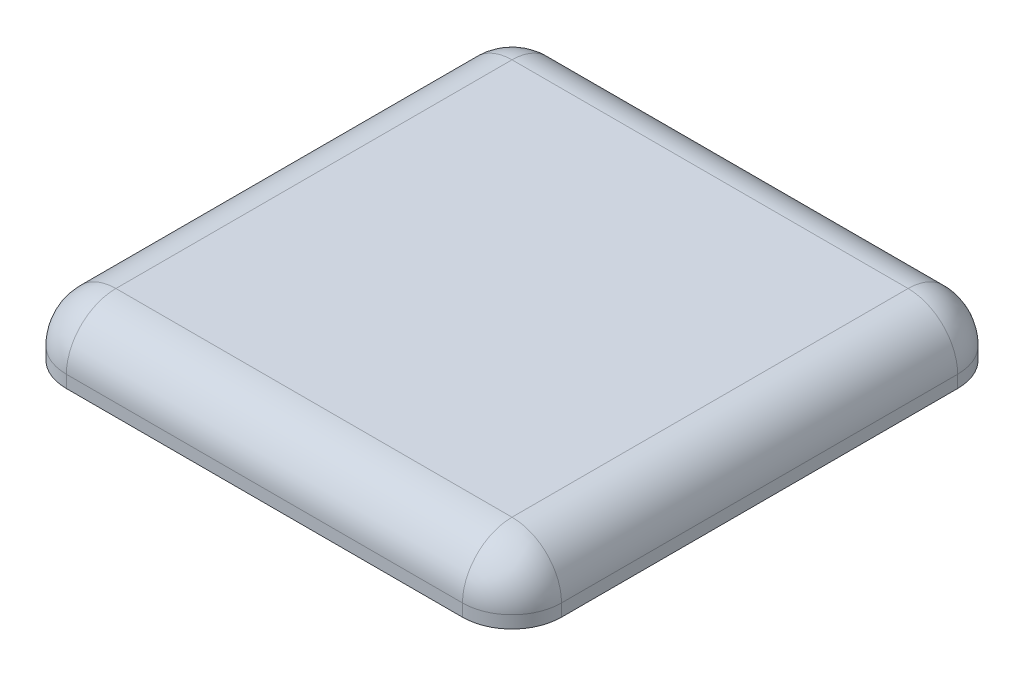
ISO-10303-21;
HEADER;
FILE_DESCRIPTION(('STEP AP214'),'2;1');
FILE_NAME('part.step','',(''),(''),'','','');
FILE_SCHEMA(('AUTOMOTIVE_DESIGN { 1 0 10303 214 1 1 1 1 }'));
ENDSEC;
DATA;
#1=APPLICATION_CONTEXT('core data for automotive mechanical design processes');
#2=APPLICATION_PROTOCOL_DEFINITION('international standard','automotive_design',2000,#1);
#3=PRODUCT_CONTEXT('',#1,'mechanical');
#4=PRODUCT('Part','Part','',(#3));
#5=PRODUCT_RELATED_PRODUCT_CATEGORY('part','',(#4));
#6=PRODUCT_DEFINITION_FORMATION('','',#4);
#7=PRODUCT_DEFINITION_CONTEXT('part definition',#1,'design');
#8=PRODUCT_DEFINITION('design','',#6,#7);
#9=PRODUCT_DEFINITION_SHAPE('','',#8);
#10=(LENGTH_UNIT() NAMED_UNIT(*) SI_UNIT(.MILLI.,.METRE.));
#11=(NAMED_UNIT(*) PLANE_ANGLE_UNIT() SI_UNIT($,.RADIAN.));
#12=(NAMED_UNIT(*) SI_UNIT($,.STERADIAN.) SOLID_ANGLE_UNIT());
#13=UNCERTAINTY_MEASURE_WITH_UNIT(LENGTH_MEASURE(1.E-05),#10,'distance_accuracy_value','');
#14=(GEOMETRIC_REPRESENTATION_CONTEXT(3) GLOBAL_UNCERTAINTY_ASSIGNED_CONTEXT((#13)) GLOBAL_UNIT_ASSIGNED_CONTEXT((#10,
#11,#12)) REPRESENTATION_CONTEXT('',''));
#15=CARTESIAN_POINT('',(0.,0.,0.));
#16=DIRECTION('',(0.,0.,1.));
#17=DIRECTION('',(1.,0.,0.));
#18=AXIS2_PLACEMENT_3D('',#15,#16,#17);
#19=CARTESIAN_POINT('',(0.,0.,0.));
#20=DIRECTION('',(0.,1.,0.));
#21=DIRECTION('',(0.,0.,1.));
#22=AXIS2_PLACEMENT_3D('',#19,#20,#21);
#23=PLANE('',#22);
#24=CARTESIAN_POINT('',(0.,0.,4.5350437814784E-09));
#25=DIRECTION('',(0.,-1.,0.));
#26=DIRECTION('',(0.,0.,1.));
#27=AXIS2_PLACEMENT_3D('',#24,#25,#26);
#28=CIRCLE('',#27,2.25000000000026);
#29=CARTESIAN_POINT('',(-2.01556443482511,0.,1.00000000906969));
#30=VERTEX_POINT('',#29);
#31=CARTESIAN_POINT('',(-2.01556443482491,0.,-1.));
#32=VERTEX_POINT('',#31);
#33=EDGE_CURVE('E231',#30,#32,#28,.T.);
#34=ORIENTED_EDGE('',*,*,#33,.F.);
#35=DIRECTION('',(-1.,0.,0.));
#36=VECTOR('',#35,1.);
#37=CARTESIAN_POINT('',(-2.01556443482511,0.,1.00000000906969));
#38=LINE('',#37,#36);
#39=CARTESIAN_POINT('',(-1.00000000453426,0.,1.00000000906969));
#40=VERTEX_POINT('',#39);
#41=EDGE_CURVE('E244',#40,#30,#38,.T.);
#42=ORIENTED_EDGE('',*,*,#41,.F.);
#43=DIRECTION('',(0.,0.,-1.));
#44=VECTOR('',#43,1.);
#45=CARTESIAN_POINT('',(-1.00000000453426,0.,1.00000000906969));
#46=LINE('',#45,#44);
#47=CARTESIAN_POINT('',(-1.00000000453426,0.,2.01556443936034));
#48=VERTEX_POINT('',#47);
#49=EDGE_CURVE('E293',#48,#40,#46,.T.);
#50=ORIENTED_EDGE('',*,*,#49,.F.);
#51=CARTESIAN_POINT('',(0.,0.,4.5350437814784E-09));
#52=DIRECTION('',(0.,-1.,0.));
#53=DIRECTION('',(0.,0.,1.));
#54=AXIS2_PLACEMENT_3D('',#51,#52,#53);
#55=CIRCLE('',#54,2.25000000000026);
#56=CARTESIAN_POINT('',(1.00000000453478,0.,2.01556443936009));
#57=VERTEX_POINT('',#56);
#58=EDGE_CURVE('E290',#57,#48,#55,.T.);
#59=ORIENTED_EDGE('',*,*,#58,.F.);
#60=DIRECTION('',(0.,0.,1.));
#61=VECTOR('',#60,1.);
#62=CARTESIAN_POINT('',(1.00000000453478,0.,2.01556443936009));
#63=LINE('',#62,#61);
#64=CARTESIAN_POINT('',(1.00000000453478,0.,1.00000000906969));
#65=VERTEX_POINT('',#64);
#66=EDGE_CURVE('E287',#65,#57,#63,.T.);
#67=ORIENTED_EDGE('',*,*,#66,.F.);
#68=DIRECTION('',(-1.,0.,0.));
#69=VECTOR('',#68,1.);
#70=CARTESIAN_POINT('',(1.00000000453478,0.,1.00000000906969));
#71=LINE('',#70,#69);
#72=CARTESIAN_POINT('',(2.01556443482511,0.,1.00000000906969));
#73=VERTEX_POINT('',#72);
#74=EDGE_CURVE('E284',#73,#65,#71,.T.);
#75=ORIENTED_EDGE('',*,*,#74,.F.);
#76=CARTESIAN_POINT('',(0.,0.,4.5350437814784E-09));
#77=DIRECTION('',(0.,-1.,0.));
#78=DIRECTION('',(0.,0.,1.));
#79=AXIS2_PLACEMENT_3D('',#76,#77,#78);
#80=CIRCLE('',#79,2.25000000000026);
#81=CARTESIAN_POINT('',(2.01556443482491,0.,-1.));
#82=VERTEX_POINT('',#81);
#83=EDGE_CURVE('E281',#82,#73,#80,.T.);
#84=ORIENTED_EDGE('',*,*,#83,.F.);
#85=DIRECTION('',(1.,0.,0.));
#86=VECTOR('',#85,1.);
#87=CARTESIAN_POINT('',(2.01556443482491,0.,-1.));
#88=LINE('',#87,#86);
#89=CARTESIAN_POINT('',(1.00000000453478,0.,-1.));
#90=VERTEX_POINT('',#89);
#91=EDGE_CURVE('E278',#90,#82,#88,.T.);
#92=ORIENTED_EDGE('',*,*,#91,.F.);
#93=DIRECTION('',(0.,0.,1.));
#94=VECTOR('',#93,1.);
#95=CARTESIAN_POINT('',(1.00000000453478,0.,-1.));
#96=LINE('',#95,#94);
#97=CARTESIAN_POINT('',(1.00000000453478,0.,-2.01556443029));
#98=VERTEX_POINT('',#97);
#99=EDGE_CURVE('E275',#98,#90,#96,.T.);
#100=ORIENTED_EDGE('',*,*,#99,.F.);
#101=CARTESIAN_POINT('',(0.,0.,4.5350437814784E-09));
#102=DIRECTION('',(0.,-1.,0.));
#103=DIRECTION('',(0.,0.,1.));
#104=AXIS2_PLACEMENT_3D('',#101,#102,#103);
#105=CIRCLE('',#104,2.25000000000026);
#106=CARTESIAN_POINT('',(-1.00000000453426,0.,-2.01556443029026));
#107=VERTEX_POINT('',#106);
#108=EDGE_CURVE('E272',#107,#98,#105,.T.);
#109=ORIENTED_EDGE('',*,*,#108,.F.);
#110=DIRECTION('',(0.,0.,-1.));
#111=VECTOR('',#110,1.);
#112=CARTESIAN_POINT('',(-1.00000000453426,0.,-2.01556443029026));
#113=LINE('',#112,#111);
#114=CARTESIAN_POINT('',(-1.00000000453426,0.,-1.));
#115=VERTEX_POINT('',#114);
#116=EDGE_CURVE('E269',#115,#107,#113,.T.);
#117=ORIENTED_EDGE('',*,*,#116,.F.);
#118=DIRECTION('',(1.,0.,0.));
#119=VECTOR('',#118,1.);
#120=CARTESIAN_POINT('',(-1.00000000453426,0.,-1.));
#121=LINE('',#120,#119);
#122=EDGE_CURVE('E234',#32,#115,#121,.T.);
#123=ORIENTED_EDGE('',*,*,#122,.F.);
#124=EDGE_LOOP('',(#34,#42,#50,#59,#67,#75,#84,#92,#100,#109,#117,#123));
#125=FACE_BOUND('',#124,.T.);
#126=DIRECTION('',(0.,0.,1.));
#127=VECTOR('',#126,1.);
#128=CARTESIAN_POINT('',(-10.,0.,-10.));
#129=LINE('',#128,#127);
#130=CARTESIAN_POINT('',(-10.,0.,-8.));
#131=VERTEX_POINT('',#130);
#132=CARTESIAN_POINT('',(-10.,0.,8.));
#133=VERTEX_POINT('',#132);
#134=EDGE_CURVE('E339',#131,#133,#129,.T.);
#135=ORIENTED_EDGE('',*,*,#134,.F.);
#136=CARTESIAN_POINT('',(-8.,0.,-8.));
#137=DIRECTION('',(0.,1.,0.));
#138=DIRECTION('',(0.,0.,1.));
#139=AXIS2_PLACEMENT_3D('',#136,#137,#138);
#140=CIRCLE('',#139,2.);
#141=CARTESIAN_POINT('',(-8.,0.,-10.));
#142=VERTEX_POINT('',#141);
#143=EDGE_CURVE('E363',#131,#142,#140,.F.);
#144=ORIENTED_EDGE('',*,*,#143,.T.);
#145=DIRECTION('',(-1.,0.,0.));
#146=VECTOR('',#145,1.);
#147=CARTESIAN_POINT('',(10.,0.,-10.));
#148=LINE('',#147,#146);
#149=CARTESIAN_POINT('',(8.,0.,-10.));
#150=VERTEX_POINT('',#149);
#151=EDGE_CURVE('E336',#150,#142,#148,.T.);
#152=ORIENTED_EDGE('',*,*,#151,.F.);
#153=CARTESIAN_POINT('',(8.,0.,-8.));
#154=DIRECTION('',(0.,1.,0.));
#155=DIRECTION('',(0.,0.,1.));
#156=AXIS2_PLACEMENT_3D('',#153,#154,#155);
#157=CIRCLE('',#156,2.);
#158=CARTESIAN_POINT('',(10.,0.,-8.));
#159=VERTEX_POINT('',#158);
#160=EDGE_CURVE('E361',#150,#159,#157,.F.);
#161=ORIENTED_EDGE('',*,*,#160,.T.);
#162=DIRECTION('',(0.,0.,-1.));
#163=VECTOR('',#162,1.);
#164=CARTESIAN_POINT('',(10.,0.,10.));
#165=LINE('',#164,#163);
#166=CARTESIAN_POINT('',(10.,0.,8.));
#167=VERTEX_POINT('',#166);
#168=EDGE_CURVE('E333',#167,#159,#165,.T.);
#169=ORIENTED_EDGE('',*,*,#168,.F.);
#170=CARTESIAN_POINT('',(8.,0.,8.));
#171=DIRECTION('',(0.,1.,0.));
#172=DIRECTION('',(0.,0.,1.));
#173=AXIS2_PLACEMENT_3D('',#170,#171,#172);
#174=CIRCLE('',#173,2.);
#175=CARTESIAN_POINT('',(8.,0.,10.));
#176=VERTEX_POINT('',#175);
#177=EDGE_CURVE('E357',#167,#176,#174,.F.);
#178=ORIENTED_EDGE('',*,*,#177,.T.);
#179=DIRECTION('',(1.,0.,0.));
#180=VECTOR('',#179,1.);
#181=CARTESIAN_POINT('',(-10.,0.,10.));
#182=LINE('',#181,#180);
#183=CARTESIAN_POINT('',(-8.,0.,10.));
#184=VERTEX_POINT('',#183);
#185=EDGE_CURVE('E342',#184,#176,#182,.T.);
#186=ORIENTED_EDGE('',*,*,#185,.F.);
#187=CARTESIAN_POINT('',(-8.,0.,8.));
#188=DIRECTION('',(0.,1.,0.));
#189=DIRECTION('',(0.,0.,1.));
#190=AXIS2_PLACEMENT_3D('',#187,#188,#189);
#191=CIRCLE('',#190,2.);
#192=EDGE_CURVE('E359',#184,#133,#191,.F.);
#193=ORIENTED_EDGE('',*,*,#192,.T.);
#194=EDGE_LOOP('',(#135,#144,#152,#161,#169,#178,#186,#193));
#195=FACE_BOUND('',#194,.T.);
#196=DIRECTION('',(1.,0.,0.));
#197=VECTOR('',#196,1.);
#198=CARTESIAN_POINT('',(-7.5,0.,-2.5));
#199=LINE('',#198,#197);
#200=CARTESIAN_POINT('',(-9.5,0.,-2.5));
#201=VERTEX_POINT('',#200);
#202=CARTESIAN_POINT('',(-7.5,0.,-2.5));
#203=VERTEX_POINT('',#202);
#204=EDGE_CURVE('E230',#201,#203,#199,.T.);
#205=ORIENTED_EDGE('',*,*,#204,.F.);
#206=DIRECTION('',(0.,0.,-1.));
#207=VECTOR('',#206,1.);
#208=CARTESIAN_POINT('',(-9.5,0.,-2.5));
#209=LINE('',#208,#207);
#210=CARTESIAN_POINT('',(-9.5,0.,2.5));
#211=VERTEX_POINT('',#210);
#212=EDGE_CURVE('E227',#211,#201,#209,.T.);
#213=ORIENTED_EDGE('',*,*,#212,.F.);
#214=DIRECTION('',(-1.,0.,0.));
#215=VECTOR('',#214,1.);
#216=CARTESIAN_POINT('',(-9.5,0.,2.5));
#217=LINE('',#216,#215);
#218=CARTESIAN_POINT('',(-7.5,0.,2.5));
#219=VERTEX_POINT('',#218);
#220=EDGE_CURVE('E420',#219,#211,#217,.T.);
#221=ORIENTED_EDGE('',*,*,#220,.F.);
#222=DIRECTION('',(0.,0.,1.));
#223=VECTOR('',#222,1.);
#224=CARTESIAN_POINT('',(-7.5,0.,2.5));
#225=LINE('',#224,#223);
#226=EDGE_CURVE('E418',#203,#219,#225,.T.);
#227=ORIENTED_EDGE('',*,*,#226,.F.);
#228=EDGE_LOOP('',(#205,#213,#221,#227));
#229=FACE_BOUND('',#228,.T.);
#230=ADVANCED_FACE('F33',(#125,#195,#229),#23,.F.);
#231=CARTESIAN_POINT('',(10.,0.,10.));
#232=DIRECTION('',(1.,0.,0.));
#233=DIRECTION('',(0.,0.,-1.));
#234=AXIS2_PLACEMENT_3D('',#231,#232,#233);
#235=PLANE('',#234);
#236=ORIENTED_EDGE('',*,*,#168,.T.);
#237=DIRECTION('',(0.,1.,0.));
#238=VECTOR('',#237,1.);
#239=CARTESIAN_POINT('',(10.,0.,-8.));
#240=LINE('',#239,#238);
#241=CARTESIAN_POINT('',(10.,0.5,-8.));
#242=VERTEX_POINT('',#241);
#243=EDGE_CURVE('E369',#159,#242,#240,.T.);
#244=ORIENTED_EDGE('',*,*,#243,.T.);
#245=DIRECTION('',(0.,0.,-1.));
#246=VECTOR('',#245,1.);
#247=CARTESIAN_POINT('',(10.,0.5,10.));
#248=LINE('',#247,#246);
#249=CARTESIAN_POINT('',(10.,0.5,8.));
#250=VERTEX_POINT('',#249);
#251=EDGE_CURVE('E367',#242,#250,#248,.F.);
#252=ORIENTED_EDGE('',*,*,#251,.T.);
#253=DIRECTION('',(0.,1.,0.));
#254=VECTOR('',#253,1.);
#255=CARTESIAN_POINT('',(10.,0.,8.));
#256=LINE('',#255,#254);
#257=EDGE_CURVE('E365',#250,#167,#256,.F.);
#258=ORIENTED_EDGE('',*,*,#257,.T.);
#259=EDGE_LOOP('',(#236,#244,#252,#258));
#260=FACE_BOUND('',#259,.T.);
#261=ADVANCED_FACE('F438',(#260),#235,.T.);
#262=CARTESIAN_POINT('',(-10.,0.,10.));
#263=DIRECTION('',(0.,0.,1.));
#264=DIRECTION('',(1.,0.,0.));
#265=AXIS2_PLACEMENT_3D('',#262,#263,#264);
#266=PLANE('',#265);
#267=DIRECTION('',(1.,0.,0.));
#268=VECTOR('',#267,1.);
#269=CARTESIAN_POINT('',(-10.,0.5,10.));
#270=LINE('',#269,#268);
#271=CARTESIAN_POINT('',(8.,0.5,10.));
#272=VERTEX_POINT('',#271);
#273=CARTESIAN_POINT('',(-8.,0.5,10.));
#274=VERTEX_POINT('',#273);
#275=EDGE_CURVE('E42',#272,#274,#270,.F.);
#276=ORIENTED_EDGE('',*,*,#275,.T.);
#277=DIRECTION('',(0.,1.,0.));
#278=VECTOR('',#277,1.);
#279=CARTESIAN_POINT('',(-8.,0.,10.));
#280=LINE('',#279,#278);
#281=EDGE_CURVE('E11',#274,#184,#280,.F.);
#282=ORIENTED_EDGE('',*,*,#281,.T.);
#283=ORIENTED_EDGE('',*,*,#185,.T.);
#284=DIRECTION('',(0.,1.,0.));
#285=VECTOR('',#284,1.);
#286=CARTESIAN_POINT('',(8.,0.,10.));
#287=LINE('',#286,#285);
#288=EDGE_CURVE('E53',#176,#272,#287,.T.);
#289=ORIENTED_EDGE('',*,*,#288,.T.);
#290=EDGE_LOOP('',(#276,#282,#283,#289));
#291=FACE_BOUND('',#290,.T.);
#292=ADVANCED_FACE('F444',(#291),#266,.T.);
#293=CARTESIAN_POINT('',(-10.,0.,-10.));
#294=DIRECTION('',(-1.,0.,0.));
#295=DIRECTION('',(0.,0.,1.));
#296=AXIS2_PLACEMENT_3D('',#293,#294,#295);
#297=PLANE('',#296);
#298=DIRECTION('',(0.,0.,1.));
#299=VECTOR('',#298,1.);
#300=CARTESIAN_POINT('',(-10.,0.5,-10.));
#301=LINE('',#300,#299);
#302=CARTESIAN_POINT('',(-10.,0.5,8.));
#303=VERTEX_POINT('',#302);
#304=CARTESIAN_POINT('',(-10.,0.5,-8.));
#305=VERTEX_POINT('',#304);
#306=EDGE_CURVE('E353',#303,#305,#301,.F.);
#307=ORIENTED_EDGE('',*,*,#306,.T.);
#308=DIRECTION('',(0.,1.,0.));
#309=VECTOR('',#308,1.);
#310=CARTESIAN_POINT('',(-10.,0.,-8.));
#311=LINE('',#310,#309);
#312=EDGE_CURVE('E355',#305,#131,#311,.F.);
#313=ORIENTED_EDGE('',*,*,#312,.T.);
#314=ORIENTED_EDGE('',*,*,#134,.T.);
#315=DIRECTION('',(0.,1.,0.));
#316=VECTOR('',#315,1.);
#317=CARTESIAN_POINT('',(-10.,0.,8.));
#318=LINE('',#317,#316);
#319=EDGE_CURVE('E351',#133,#303,#318,.T.);
#320=ORIENTED_EDGE('',*,*,#319,.T.);
#321=EDGE_LOOP('',(#307,#313,#314,#320));
#322=FACE_BOUND('',#321,.T.);
#323=ADVANCED_FACE('F459',(#322),#297,.T.);
#324=CARTESIAN_POINT('',(10.,0.,-10.));
#325=DIRECTION('',(0.,0.,-1.));
#326=DIRECTION('',(-1.,0.,0.));
#327=AXIS2_PLACEMENT_3D('',#324,#325,#326);
#328=PLANE('',#327);
#329=ORIENTED_EDGE('',*,*,#151,.T.);
#330=DIRECTION('',(0.,1.,0.));
#331=VECTOR('',#330,1.);
#332=CARTESIAN_POINT('',(-8.,0.,-10.));
#333=LINE('',#332,#331);
#334=CARTESIAN_POINT('',(-8.,0.5,-10.));
#335=VERTEX_POINT('',#334);
#336=EDGE_CURVE('E348',#142,#335,#333,.T.);
#337=ORIENTED_EDGE('',*,*,#336,.T.);
#338=DIRECTION('',(-1.,0.,0.));
#339=VECTOR('',#338,1.);
#340=CARTESIAN_POINT('',(10.,0.5,-10.));
#341=LINE('',#340,#339);
#342=CARTESIAN_POINT('',(8.,0.5,-10.));
#343=VERTEX_POINT('',#342);
#344=EDGE_CURVE('E344',#335,#343,#341,.F.);
#345=ORIENTED_EDGE('',*,*,#344,.T.);
#346=DIRECTION('',(0.,1.,0.));
#347=VECTOR('',#346,1.);
#348=CARTESIAN_POINT('',(8.,0.,-10.));
#349=LINE('',#348,#347);
#350=EDGE_CURVE('E346',#343,#150,#349,.F.);
#351=ORIENTED_EDGE('',*,*,#350,.T.);
#352=EDGE_LOOP('',(#329,#337,#345,#351));
#353=FACE_BOUND('',#352,.T.);
#354=ADVANCED_FACE('F455',(#353),#328,.T.);
#355=CARTESIAN_POINT('',(0.,2.5,0.));
#356=DIRECTION('',(0.,1.,0.));
#357=DIRECTION('',(0.,0.,1.));
#358=AXIS2_PLACEMENT_3D('',#355,#356,#357);
#359=PLANE('',#358);
#360=DIRECTION('',(0.,0.,-1.));
#361=VECTOR('',#360,1.);
#362=CARTESIAN_POINT('',(8.,2.5,0.));
#363=LINE('',#362,#361);
#364=CARTESIAN_POINT('',(8.,2.5,8.));
#365=VERTEX_POINT('',#364);
#366=CARTESIAN_POINT('',(8.,2.5,-8.));
#367=VERTEX_POINT('',#366);
#368=EDGE_CURVE('E373',#365,#367,#363,.T.);
#369=ORIENTED_EDGE('',*,*,#368,.T.);
#370=DIRECTION('',(-1.,0.,0.));
#371=VECTOR('',#370,1.);
#372=CARTESIAN_POINT('',(0.,2.5,-8.));
#373=LINE('',#372,#371);
#374=CARTESIAN_POINT('',(-8.,2.5,-8.));
#375=VERTEX_POINT('',#374);
#376=EDGE_CURVE('E377',#367,#375,#373,.T.);
#377=ORIENTED_EDGE('',*,*,#376,.T.);
#378=DIRECTION('',(0.,0.,1.));
#379=VECTOR('',#378,1.);
#380=CARTESIAN_POINT('',(-8.,2.5,0.));
#381=LINE('',#380,#379);
#382=CARTESIAN_POINT('',(-8.,2.5,8.));
#383=VERTEX_POINT('',#382);
#384=EDGE_CURVE('E375',#375,#383,#381,.T.);
#385=ORIENTED_EDGE('',*,*,#384,.T.);
#386=DIRECTION('',(1.,0.,0.));
#387=VECTOR('',#386,1.);
#388=CARTESIAN_POINT('',(0.,2.5,8.));
#389=LINE('',#388,#387);
#390=EDGE_CURVE('E371',#383,#365,#389,.T.);
#391=ORIENTED_EDGE('',*,*,#390,.T.);
#392=EDGE_LOOP('',(#369,#377,#385,#391));
#393=FACE_BOUND('',#392,.T.);
#394=ADVANCED_FACE('F452',(#393),#359,.T.);
#395=CARTESIAN_POINT('',(0.,-6.,4.5350437814784E-09));
#396=DIRECTION('',(0.,1.,0.));
#397=DIRECTION('',(0.,0.,1.));
#398=AXIS2_PLACEMENT_3D('',#395,#396,#397);
#399=CYLINDRICAL_SURFACE('',#398,2.25000000000026);
#400=ORIENTED_EDGE('',*,*,#33,.T.);
#401=DIRECTION('',(0.,1.,0.));
#402=VECTOR('',#401,1.);
#403=CARTESIAN_POINT('',(-2.01556443482491,-6.,-1.));
#404=LINE('',#403,#402);
#405=CARTESIAN_POINT('',(-2.01556443482491,-6.,-1.));
#406=VERTEX_POINT('',#405);
#407=EDGE_CURVE('E330',#406,#32,#404,.T.);
#408=ORIENTED_EDGE('',*,*,#407,.F.);
#409=CARTESIAN_POINT('',(0.,-6.,4.5350437814784E-09));
#410=DIRECTION('',(0.,-1.,0.));
#411=DIRECTION('',(0.,0.,1.));
#412=AXIS2_PLACEMENT_3D('',#409,#410,#411);
#413=CIRCLE('',#412,2.25000000000026);
#414=CARTESIAN_POINT('',(-2.01556443482511,-6.,1.00000000906969));
#415=VERTEX_POINT('',#414);
#416=EDGE_CURVE('E240',#415,#406,#413,.T.);
#417=ORIENTED_EDGE('',*,*,#416,.F.);
#418=DIRECTION('',(0.,1.,0.));
#419=VECTOR('',#418,1.);
#420=CARTESIAN_POINT('',(-2.01556443482511,-6.,1.00000000906969));
#421=LINE('',#420,#419);
#422=EDGE_CURVE('E265',#415,#30,#421,.T.);
#423=ORIENTED_EDGE('',*,*,#422,.T.);
#424=EDGE_LOOP('',(#400,#408,#417,#423));
#425=FACE_BOUND('',#424,.T.);
#426=ADVANCED_FACE('F450',(#425),#399,.T.);
#427=CARTESIAN_POINT('',(-1.00000000453426,-6.,-1.));
#428=DIRECTION('',(0.,0.,1.));
#429=DIRECTION('',(1.,0.,0.));
#430=AXIS2_PLACEMENT_3D('',#427,#428,#429);
#431=PLANE('',#430);
#432=ORIENTED_EDGE('',*,*,#122,.T.);
#433=DIRECTION('',(0.,1.,0.));
#434=VECTOR('',#433,1.);
#435=CARTESIAN_POINT('',(-1.00000000453426,-6.,-1.));
#436=LINE('',#435,#434);
#437=CARTESIAN_POINT('',(-1.00000000453426,-6.,-1.));
#438=VERTEX_POINT('',#437);
#439=EDGE_CURVE('E327',#438,#115,#436,.T.);
#440=ORIENTED_EDGE('',*,*,#439,.F.);
#441=DIRECTION('',(1.,0.,0.));
#442=VECTOR('',#441,1.);
#443=CARTESIAN_POINT('',(-1.00000000453426,-6.,-1.));
#444=LINE('',#443,#442);
#445=EDGE_CURVE('E243',#406,#438,#444,.T.);
#446=ORIENTED_EDGE('',*,*,#445,.F.);
#447=ORIENTED_EDGE('',*,*,#407,.T.);
#448=EDGE_LOOP('',(#432,#440,#446,#447));
#449=FACE_BOUND('',#448,.T.);
#450=ADVANCED_FACE('F595',(#449),#431,.F.);
#451=CARTESIAN_POINT('',(-1.00000000453426,-6.,-2.01556443029026));
#452=DIRECTION('',(1.,0.,0.));
#453=DIRECTION('',(0.,0.,-1.));
#454=AXIS2_PLACEMENT_3D('',#451,#452,#453);
#455=PLANE('',#454);
#456=ORIENTED_EDGE('',*,*,#116,.T.);
#457=DIRECTION('',(0.,1.,0.));
#458=VECTOR('',#457,1.);
#459=CARTESIAN_POINT('',(-1.00000000453426,-6.,-2.01556443029026));
#460=LINE('',#459,#458);
#461=CARTESIAN_POINT('',(-1.00000000453426,-6.,-2.01556443029026));
#462=VERTEX_POINT('',#461);
#463=EDGE_CURVE('E324',#462,#107,#460,.T.);
#464=ORIENTED_EDGE('',*,*,#463,.F.);
#465=DIRECTION('',(0.,0.,-1.));
#466=VECTOR('',#465,1.);
#467=CARTESIAN_POINT('',(-1.00000000453426,-6.,-2.01556443029026));
#468=LINE('',#467,#466);
#469=EDGE_CURVE('E246',#438,#462,#468,.T.);
#470=ORIENTED_EDGE('',*,*,#469,.F.);
#471=ORIENTED_EDGE('',*,*,#439,.T.);
#472=EDGE_LOOP('',(#456,#464,#470,#471));
#473=FACE_BOUND('',#472,.T.);
#474=ADVANCED_FACE('F592',(#473),#455,.F.);
#475=CARTESIAN_POINT('',(0.,-6.,4.5350437814784E-09));
#476=DIRECTION('',(0.,1.,0.));
#477=DIRECTION('',(0.,0.,1.));
#478=AXIS2_PLACEMENT_3D('',#475,#476,#477);
#479=CYLINDRICAL_SURFACE('',#478,2.25000000000026);
#480=ORIENTED_EDGE('',*,*,#108,.T.);
#481=DIRECTION('',(0.,1.,0.));
#482=VECTOR('',#481,1.);
#483=CARTESIAN_POINT('',(1.00000000453478,-6.,-2.01556443029));
#484=LINE('',#483,#482);
#485=CARTESIAN_POINT('',(1.00000000453478,-6.,-2.01556443029));
#486=VERTEX_POINT('',#485);
#487=EDGE_CURVE('E321',#486,#98,#484,.T.);
#488=ORIENTED_EDGE('',*,*,#487,.F.);
#489=CARTESIAN_POINT('',(0.,-6.,4.5350437814784E-09));
#490=DIRECTION('',(0.,-1.,0.));
#491=DIRECTION('',(0.,0.,1.));
#492=AXIS2_PLACEMENT_3D('',#489,#490,#491);
#493=CIRCLE('',#492,2.25000000000026);
#494=EDGE_CURVE('E248',#462,#486,#493,.T.);
#495=ORIENTED_EDGE('',*,*,#494,.F.);
#496=ORIENTED_EDGE('',*,*,#463,.T.);
#497=EDGE_LOOP('',(#480,#488,#495,#496));
#498=FACE_BOUND('',#497,.T.);
#499=ADVANCED_FACE('F588',(#498),#479,.T.);
#500=CARTESIAN_POINT('',(1.00000000453478,-6.,-1.));
#501=DIRECTION('',(-1.,0.,0.));
#502=DIRECTION('',(0.,0.,1.));
#503=AXIS2_PLACEMENT_3D('',#500,#501,#502);
#504=PLANE('',#503);
#505=ORIENTED_EDGE('',*,*,#99,.T.);
#506=DIRECTION('',(0.,1.,0.));
#507=VECTOR('',#506,1.);
#508=CARTESIAN_POINT('',(1.00000000453478,-6.,-1.));
#509=LINE('',#508,#507);
#510=CARTESIAN_POINT('',(1.00000000453478,-6.,-1.));
#511=VERTEX_POINT('',#510);
#512=EDGE_CURVE('E318',#511,#90,#509,.T.);
#513=ORIENTED_EDGE('',*,*,#512,.F.);
#514=DIRECTION('',(0.,0.,1.));
#515=VECTOR('',#514,1.);
#516=CARTESIAN_POINT('',(1.00000000453478,-6.,-1.));
#517=LINE('',#516,#515);
#518=EDGE_CURVE('E250',#486,#511,#517,.T.);
#519=ORIENTED_EDGE('',*,*,#518,.F.);
#520=ORIENTED_EDGE('',*,*,#487,.T.);
#521=EDGE_LOOP('',(#505,#513,#519,#520));
#522=FACE_BOUND('',#521,.T.);
#523=ADVANCED_FACE('F584',(#522),#504,.F.);
#524=CARTESIAN_POINT('',(2.01556443482491,-6.,-1.));
#525=DIRECTION('',(0.,0.,1.));
#526=DIRECTION('',(1.,0.,0.));
#527=AXIS2_PLACEMENT_3D('',#524,#525,#526);
#528=PLANE('',#527);
#529=ORIENTED_EDGE('',*,*,#91,.T.);
#530=DIRECTION('',(0.,1.,0.));
#531=VECTOR('',#530,1.);
#532=CARTESIAN_POINT('',(2.01556443482491,-6.,-1.));
#533=LINE('',#532,#531);
#534=CARTESIAN_POINT('',(2.01556443482491,-6.,-1.));
#535=VERTEX_POINT('',#534);
#536=EDGE_CURVE('E315',#535,#82,#533,.T.);
#537=ORIENTED_EDGE('',*,*,#536,.F.);
#538=DIRECTION('',(1.,0.,0.));
#539=VECTOR('',#538,1.);
#540=CARTESIAN_POINT('',(2.01556443482491,-6.,-1.));
#541=LINE('',#540,#539);
#542=EDGE_CURVE('E252',#511,#535,#541,.T.);
#543=ORIENTED_EDGE('',*,*,#542,.F.);
#544=ORIENTED_EDGE('',*,*,#512,.T.);
#545=EDGE_LOOP('',(#529,#537,#543,#544));
#546=FACE_BOUND('',#545,.T.);
#547=ADVANCED_FACE('F580',(#546),#528,.F.);
#548=CARTESIAN_POINT('',(0.,-6.,4.5350437814784E-09));
#549=DIRECTION('',(0.,1.,0.));
#550=DIRECTION('',(0.,0.,1.));
#551=AXIS2_PLACEMENT_3D('',#548,#549,#550);
#552=CYLINDRICAL_SURFACE('',#551,2.25000000000026);
#553=ORIENTED_EDGE('',*,*,#83,.T.);
#554=DIRECTION('',(0.,1.,0.));
#555=VECTOR('',#554,1.);
#556=CARTESIAN_POINT('',(2.01556443482511,-6.,1.00000000906969));
#557=LINE('',#556,#555);
#558=CARTESIAN_POINT('',(2.01556443482511,-6.,1.00000000906969));
#559=VERTEX_POINT('',#558);
#560=EDGE_CURVE('E312',#559,#73,#557,.T.);
#561=ORIENTED_EDGE('',*,*,#560,.F.);
#562=CARTESIAN_POINT('',(0.,-6.,4.5350437814784E-09));
#563=DIRECTION('',(0.,-1.,0.));
#564=DIRECTION('',(0.,0.,1.));
#565=AXIS2_PLACEMENT_3D('',#562,#563,#564);
#566=CIRCLE('',#565,2.25000000000026);
#567=EDGE_CURVE('E254',#535,#559,#566,.T.);
#568=ORIENTED_EDGE('',*,*,#567,.F.);
#569=ORIENTED_EDGE('',*,*,#536,.T.);
#570=EDGE_LOOP('',(#553,#561,#568,#569));
#571=FACE_BOUND('',#570,.T.);
#572=ADVANCED_FACE('F576',(#571),#552,.T.);
#573=CARTESIAN_POINT('',(1.00000000453478,-6.,1.00000000906969));
#574=DIRECTION('',(0.,0.,-1.));
#575=DIRECTION('',(-1.,0.,0.));
#576=AXIS2_PLACEMENT_3D('',#573,#574,#575);
#577=PLANE('',#576);
#578=ORIENTED_EDGE('',*,*,#74,.T.);
#579=DIRECTION('',(0.,1.,0.));
#580=VECTOR('',#579,1.);
#581=CARTESIAN_POINT('',(1.00000000453478,-6.,1.00000000906969));
#582=LINE('',#581,#580);
#583=CARTESIAN_POINT('',(1.00000000453478,-6.,1.00000000906969));
#584=VERTEX_POINT('',#583);
#585=EDGE_CURVE('E309',#584,#65,#582,.T.);
#586=ORIENTED_EDGE('',*,*,#585,.F.);
#587=DIRECTION('',(-1.,0.,0.));
#588=VECTOR('',#587,1.);
#589=CARTESIAN_POINT('',(1.00000000453478,-6.,1.00000000906969));
#590=LINE('',#589,#588);
#591=EDGE_CURVE('E256',#559,#584,#590,.T.);
#592=ORIENTED_EDGE('',*,*,#591,.F.);
#593=ORIENTED_EDGE('',*,*,#560,.T.);
#594=EDGE_LOOP('',(#578,#586,#592,#593));
#595=FACE_BOUND('',#594,.T.);
#596=ADVANCED_FACE('F572',(#595),#577,.F.);
#597=CARTESIAN_POINT('',(1.00000000453478,-6.,2.01556443936009));
#598=DIRECTION('',(-1.,0.,0.));
#599=DIRECTION('',(0.,0.,1.));
#600=AXIS2_PLACEMENT_3D('',#597,#598,#599);
#601=PLANE('',#600);
#602=ORIENTED_EDGE('',*,*,#66,.T.);
#603=DIRECTION('',(0.,1.,0.));
#604=VECTOR('',#603,1.);
#605=CARTESIAN_POINT('',(1.00000000453478,-6.,2.01556443936009));
#606=LINE('',#605,#604);
#607=CARTESIAN_POINT('',(1.00000000453478,-6.,2.01556443936009));
#608=VERTEX_POINT('',#607);
#609=EDGE_CURVE('E306',#608,#57,#606,.T.);
#610=ORIENTED_EDGE('',*,*,#609,.F.);
#611=DIRECTION('',(0.,0.,1.));
#612=VECTOR('',#611,1.);
#613=CARTESIAN_POINT('',(1.00000000453478,-6.,2.01556443936009));
#614=LINE('',#613,#612);
#615=EDGE_CURVE('E258',#584,#608,#614,.T.);
#616=ORIENTED_EDGE('',*,*,#615,.F.);
#617=ORIENTED_EDGE('',*,*,#585,.T.);
#618=EDGE_LOOP('',(#602,#610,#616,#617));
#619=FACE_BOUND('',#618,.T.);
#620=ADVANCED_FACE('F568',(#619),#601,.F.);
#621=CARTESIAN_POINT('',(0.,-6.,4.5350437814784E-09));
#622=DIRECTION('',(0.,1.,0.));
#623=DIRECTION('',(0.,0.,1.));
#624=AXIS2_PLACEMENT_3D('',#621,#622,#623);
#625=CYLINDRICAL_SURFACE('',#624,2.25000000000026);
#626=ORIENTED_EDGE('',*,*,#58,.T.);
#627=DIRECTION('',(0.,1.,0.));
#628=VECTOR('',#627,1.);
#629=CARTESIAN_POINT('',(-1.00000000453426,-6.,2.01556443936034));
#630=LINE('',#629,#628);
#631=CARTESIAN_POINT('',(-1.00000000453426,-6.,2.01556443936034));
#632=VERTEX_POINT('',#631);
#633=EDGE_CURVE('E303',#632,#48,#630,.T.);
#634=ORIENTED_EDGE('',*,*,#633,.F.);
#635=CARTESIAN_POINT('',(0.,-6.,4.5350437814784E-09));
#636=DIRECTION('',(0.,-1.,0.));
#637=DIRECTION('',(0.,0.,1.));
#638=AXIS2_PLACEMENT_3D('',#635,#636,#637);
#639=CIRCLE('',#638,2.25000000000026);
#640=EDGE_CURVE('E260',#608,#632,#639,.T.);
#641=ORIENTED_EDGE('',*,*,#640,.F.);
#642=ORIENTED_EDGE('',*,*,#609,.T.);
#643=EDGE_LOOP('',(#626,#634,#641,#642));
#644=FACE_BOUND('',#643,.T.);
#645=ADVANCED_FACE('F564',(#644),#625,.T.);
#646=CARTESIAN_POINT('',(-1.00000000453426,-6.,1.00000000906969));
#647=DIRECTION('',(1.,0.,0.));
#648=DIRECTION('',(0.,0.,-1.));
#649=AXIS2_PLACEMENT_3D('',#646,#647,#648);
#650=PLANE('',#649);
#651=ORIENTED_EDGE('',*,*,#49,.T.);
#652=DIRECTION('',(0.,1.,0.));
#653=VECTOR('',#652,1.);
#654=CARTESIAN_POINT('',(-1.00000000453426,-6.,1.00000000906969));
#655=LINE('',#654,#653);
#656=CARTESIAN_POINT('',(-1.00000000453426,-6.,1.00000000906969));
#657=VERTEX_POINT('',#656);
#658=EDGE_CURVE('E300',#657,#40,#655,.T.);
#659=ORIENTED_EDGE('',*,*,#658,.F.);
#660=DIRECTION('',(0.,0.,-1.));
#661=VECTOR('',#660,1.);
#662=CARTESIAN_POINT('',(-1.00000000453426,-6.,1.00000000906969));
#663=LINE('',#662,#661);
#664=EDGE_CURVE('E262',#632,#657,#663,.T.);
#665=ORIENTED_EDGE('',*,*,#664,.F.);
#666=ORIENTED_EDGE('',*,*,#633,.T.);
#667=EDGE_LOOP('',(#651,#659,#665,#666));
#668=FACE_BOUND('',#667,.T.);
#669=ADVANCED_FACE('F560',(#668),#650,.F.);
#670=CARTESIAN_POINT('',(-2.01556443482511,-6.,1.00000000906969));
#671=DIRECTION('',(0.,0.,-1.));
#672=DIRECTION('',(-1.,0.,0.));
#673=AXIS2_PLACEMENT_3D('',#670,#671,#672);
#674=PLANE('',#673);
#675=ORIENTED_EDGE('',*,*,#41,.T.);
#676=ORIENTED_EDGE('',*,*,#422,.F.);
#677=DIRECTION('',(-1.,0.,0.));
#678=VECTOR('',#677,1.);
#679=CARTESIAN_POINT('',(-2.01556443482511,-6.,1.00000000906969));
#680=LINE('',#679,#678);
#681=EDGE_CURVE('E264',#657,#415,#680,.T.);
#682=ORIENTED_EDGE('',*,*,#681,.F.);
#683=ORIENTED_EDGE('',*,*,#658,.T.);
#684=EDGE_LOOP('',(#675,#676,#682,#683));
#685=FACE_BOUND('',#684,.T.);
#686=ADVANCED_FACE('F556',(#685),#674,.F.);
#687=CARTESIAN_POINT('',(0.,-6.,4.5350437814784E-09));
#688=DIRECTION('',(0.,1.,0.));
#689=DIRECTION('',(0.,0.,1.));
#690=AXIS2_PLACEMENT_3D('',#687,#688,#689);
#691=PLANE('',#690);
#692=ORIENTED_EDGE('',*,*,#416,.T.);
#693=ORIENTED_EDGE('',*,*,#445,.T.);
#694=ORIENTED_EDGE('',*,*,#469,.T.);
#695=ORIENTED_EDGE('',*,*,#494,.T.);
#696=ORIENTED_EDGE('',*,*,#518,.T.);
#697=ORIENTED_EDGE('',*,*,#542,.T.);
#698=ORIENTED_EDGE('',*,*,#567,.T.);
#699=ORIENTED_EDGE('',*,*,#591,.T.);
#700=ORIENTED_EDGE('',*,*,#615,.T.);
#701=ORIENTED_EDGE('',*,*,#640,.T.);
#702=ORIENTED_EDGE('',*,*,#664,.T.);
#703=ORIENTED_EDGE('',*,*,#681,.T.);
#704=EDGE_LOOP('',(#692,#693,#694,#695,#696,#697,#698,#699,#700,#701,#702,#703));
#705=FACE_BOUND('',#704,.T.);
#706=ADVANCED_FACE('F553',(#705),#691,.F.);
#707=CARTESIAN_POINT('',(-7.5,-3.,-2.5));
#708=DIRECTION('',(0.,0.,1.));
#709=DIRECTION('',(1.,0.,0.));
#710=AXIS2_PLACEMENT_3D('',#707,#708,#709);
#711=PLANE('',#710);
#712=ORIENTED_EDGE('',*,*,#204,.T.);
#713=DIRECTION('',(0.,1.,0.));
#714=VECTOR('',#713,1.);
#715=CARTESIAN_POINT('',(-7.5,-3.,-2.5));
#716=LINE('',#715,#714);
#717=CARTESIAN_POINT('',(-7.5,-3.,-2.5));
#718=VERTEX_POINT('',#717);
#719=EDGE_CURVE('E211',#718,#203,#716,.T.);
#720=ORIENTED_EDGE('',*,*,#719,.F.);
#721=DIRECTION('',(1.,0.,0.));
#722=VECTOR('',#721,1.);
#723=CARTESIAN_POINT('',(-7.5,-3.,-2.5));
#724=LINE('',#723,#722);
#725=CARTESIAN_POINT('',(-9.5,-3.,-2.5));
#726=VERTEX_POINT('',#725);
#727=EDGE_CURVE('E218',#726,#718,#724,.T.);
#728=ORIENTED_EDGE('',*,*,#727,.F.);
#729=DIRECTION('',(0.,1.,0.));
#730=VECTOR('',#729,1.);
#731=CARTESIAN_POINT('',(-9.5,-3.,-2.5));
#732=LINE('',#731,#730);
#733=EDGE_CURVE('E429',#726,#201,#732,.T.);
#734=ORIENTED_EDGE('',*,*,#733,.T.);
#735=EDGE_LOOP('',(#712,#720,#728,#734));
#736=FACE_BOUND('',#735,.T.);
#737=ADVANCED_FACE('F229',(#736),#711,.F.);
#738=CARTESIAN_POINT('',(-7.5,-3.,2.5));
#739=DIRECTION('',(-1.,0.,0.));
#740=DIRECTION('',(0.,0.,1.));
#741=AXIS2_PLACEMENT_3D('',#738,#739,#740);
#742=PLANE('',#741);
#743=ORIENTED_EDGE('',*,*,#226,.T.);
#744=DIRECTION('',(0.,1.,0.));
#745=VECTOR('',#744,1.);
#746=CARTESIAN_POINT('',(-7.5,-3.,2.5));
#747=LINE('',#746,#745);
#748=CARTESIAN_POINT('',(-7.5,-3.,2.5));
#749=VERTEX_POINT('',#748);
#750=EDGE_CURVE('E214',#749,#219,#747,.T.);
#751=ORIENTED_EDGE('',*,*,#750,.F.);
#752=DIRECTION('',(0.,0.,1.));
#753=VECTOR('',#752,1.);
#754=CARTESIAN_POINT('',(-7.5,-3.,2.5));
#755=LINE('',#754,#753);
#756=EDGE_CURVE('E206',#718,#749,#755,.T.);
#757=ORIENTED_EDGE('',*,*,#756,.F.);
#758=ORIENTED_EDGE('',*,*,#719,.T.);
#759=EDGE_LOOP('',(#743,#751,#757,#758));
#760=FACE_BOUND('',#759,.T.);
#761=ADVANCED_FACE('F209',(#760),#742,.F.);
#762=CARTESIAN_POINT('',(-9.5,-3.,2.5));
#763=DIRECTION('',(0.,0.,-1.));
#764=DIRECTION('',(-1.,0.,0.));
#765=AXIS2_PLACEMENT_3D('',#762,#763,#764);
#766=PLANE('',#765);
#767=ORIENTED_EDGE('',*,*,#220,.T.);
#768=DIRECTION('',(0.,1.,0.));
#769=VECTOR('',#768,1.);
#770=CARTESIAN_POINT('',(-9.5,-3.,2.5));
#771=LINE('',#770,#769);
#772=CARTESIAN_POINT('',(-9.5,-3.,2.5));
#773=VERTEX_POINT('',#772);
#774=EDGE_CURVE('E236',#773,#211,#771,.T.);
#775=ORIENTED_EDGE('',*,*,#774,.F.);
#776=DIRECTION('',(-1.,0.,0.));
#777=VECTOR('',#776,1.);
#778=CARTESIAN_POINT('',(-9.5,-3.,2.5));
#779=LINE('',#778,#777);
#780=EDGE_CURVE('E217',#749,#773,#779,.T.);
#781=ORIENTED_EDGE('',*,*,#780,.F.);
#782=ORIENTED_EDGE('',*,*,#750,.T.);
#783=EDGE_LOOP('',(#767,#775,#781,#782));
#784=FACE_BOUND('',#783,.T.);
#785=ADVANCED_FACE('F435',(#784),#766,.F.);
#786=CARTESIAN_POINT('',(-9.5,-3.,-2.5));
#787=DIRECTION('',(1.,0.,0.));
#788=DIRECTION('',(0.,0.,-1.));
#789=AXIS2_PLACEMENT_3D('',#786,#787,#788);
#790=PLANE('',#789);
#791=ORIENTED_EDGE('',*,*,#212,.T.);
#792=ORIENTED_EDGE('',*,*,#733,.F.);
#793=DIRECTION('',(0.,0.,-1.));
#794=VECTOR('',#793,1.);
#795=CARTESIAN_POINT('',(-9.5,-3.,-2.5));
#796=LINE('',#795,#794);
#797=EDGE_CURVE('E223',#773,#726,#796,.T.);
#798=ORIENTED_EDGE('',*,*,#797,.F.);
#799=ORIENTED_EDGE('',*,*,#774,.T.);
#800=EDGE_LOOP('',(#791,#792,#798,#799));
#801=FACE_BOUND('',#800,.T.);
#802=ADVANCED_FACE('F433',(#801),#790,.F.);
#803=CARTESIAN_POINT('',(0.,-3.,0.));
#804=DIRECTION('',(0.,1.,0.));
#805=DIRECTION('',(0.,0.,1.));
#806=AXIS2_PLACEMENT_3D('',#803,#804,#805);
#807=PLANE('',#806);
#808=ORIENTED_EDGE('',*,*,#727,.T.);
#809=ORIENTED_EDGE('',*,*,#756,.T.);
#810=ORIENTED_EDGE('',*,*,#780,.T.);
#811=ORIENTED_EDGE('',*,*,#797,.T.);
#812=EDGE_LOOP('',(#808,#809,#810,#811));
#813=FACE_BOUND('',#812,.T.);
#814=ADVANCED_FACE('F221',(#813),#807,.F.);
#815=CARTESIAN_POINT('',(8.,0.,8.));
#816=DIRECTION('',(0.,1.,0.));
#817=DIRECTION('',(0.,0.,1.));
#818=AXIS2_PLACEMENT_3D('',#815,#816,#817);
#819=CYLINDRICAL_SURFACE('',#818,2.);
#820=CARTESIAN_POINT('',(8.,0.5,8.));
#821=DIRECTION('',(0.,1.,0.));
#822=DIRECTION('',(0.,0.,1.));
#823=AXIS2_PLACEMENT_3D('',#820,#821,#822);
#824=CIRCLE('',#823,2.);
#825=EDGE_CURVE('E37',#272,#250,#824,.T.);
#826=ORIENTED_EDGE('',*,*,#825,.F.);
#827=ORIENTED_EDGE('',*,*,#288,.F.);
#828=ORIENTED_EDGE('',*,*,#177,.F.);
#829=ORIENTED_EDGE('',*,*,#257,.F.);
#830=EDGE_LOOP('',(#826,#827,#828,#829));
#831=FACE_BOUND('',#830,.T.);
#832=ADVANCED_FACE('F35',(#831),#819,.T.);
#833=CARTESIAN_POINT('',(8.,0.5,8.));
#834=DIRECTION('',(0.,0.,1.));
#835=DIRECTION('',(1.,0.,0.));
#836=AXIS2_PLACEMENT_3D('',#833,#834,#835);
#837=SPHERICAL_SURFACE('',#836,2.);
#838=CARTESIAN_POINT('',(8.,0.5,8.));
#839=DIRECTION('',(1.,0.,0.));
#840=DIRECTION('',(0.,0.,-1.));
#841=AXIS2_PLACEMENT_3D('',#838,#839,#840);
#842=CIRCLE('',#841,2.);
#843=EDGE_CURVE('E407',#272,#365,#842,.F.);
#844=ORIENTED_EDGE('',*,*,#843,.F.);
#845=ORIENTED_EDGE('',*,*,#825,.T.);
#846=CARTESIAN_POINT('',(8.,0.5,8.));
#847=DIRECTION('',(0.,0.,1.));
#848=DIRECTION('',(1.,0.,0.));
#849=AXIS2_PLACEMENT_3D('',#846,#847,#848);
#850=CIRCLE('',#849,2.);
#851=EDGE_CURVE('E409',#365,#250,#850,.F.);
#852=ORIENTED_EDGE('',*,*,#851,.F.);
#853=EDGE_LOOP('',(#844,#845,#852));
#854=FACE_BOUND('',#853,.T.);
#855=ADVANCED_FACE('F503',(#854),#837,.T.);
#856=CARTESIAN_POINT('',(8.,0.,-8.));
#857=DIRECTION('',(0.,1.,0.));
#858=DIRECTION('',(0.,0.,1.));
#859=AXIS2_PLACEMENT_3D('',#856,#857,#858);
#860=CYLINDRICAL_SURFACE('',#859,2.);
#861=ORIENTED_EDGE('',*,*,#160,.F.);
#862=ORIENTED_EDGE('',*,*,#350,.F.);
#863=CARTESIAN_POINT('',(8.,0.5,-8.));
#864=DIRECTION('',(0.,1.,0.));
#865=DIRECTION('',(0.,0.,1.));
#866=AXIS2_PLACEMENT_3D('',#863,#864,#865);
#867=CIRCLE('',#866,2.);
#868=EDGE_CURVE('E404',#242,#343,#867,.T.);
#869=ORIENTED_EDGE('',*,*,#868,.F.);
#870=ORIENTED_EDGE('',*,*,#243,.F.);
#871=EDGE_LOOP('',(#861,#862,#869,#870));
#872=FACE_BOUND('',#871,.T.);
#873=ADVANCED_FACE('F501',(#872),#860,.T.);
#874=CARTESIAN_POINT('',(8.,0.5,0.));
#875=DIRECTION('',(0.,0.,-1.));
#876=DIRECTION('',(-1.,0.,0.));
#877=AXIS2_PLACEMENT_3D('',#874,#875,#876);
#878=CYLINDRICAL_SURFACE('',#877,2.);
#879=ORIENTED_EDGE('',*,*,#851,.T.);
#880=ORIENTED_EDGE('',*,*,#251,.F.);
#881=CARTESIAN_POINT('',(8.,0.5,-8.));
#882=DIRECTION('',(0.,0.,-1.));
#883=DIRECTION('',(-1.,0.,0.));
#884=AXIS2_PLACEMENT_3D('',#881,#882,#883);
#885=CIRCLE('',#884,2.);
#886=EDGE_CURVE('E401',#367,#242,#885,.T.);
#887=ORIENTED_EDGE('',*,*,#886,.F.);
#888=ORIENTED_EDGE('',*,*,#368,.F.);
#889=EDGE_LOOP('',(#879,#880,#887,#888));
#890=FACE_BOUND('',#889,.T.);
#891=ADVANCED_FACE('F497',(#890),#878,.T.);
#892=CARTESIAN_POINT('',(0.,0.5,8.));
#893=DIRECTION('',(1.,0.,0.));
#894=DIRECTION('',(0.,0.,-1.));
#895=AXIS2_PLACEMENT_3D('',#892,#893,#894);
#896=CYLINDRICAL_SURFACE('',#895,2.);
#897=ORIENTED_EDGE('',*,*,#843,.T.);
#898=ORIENTED_EDGE('',*,*,#390,.F.);
#899=CARTESIAN_POINT('',(-8.,0.5,8.));
#900=DIRECTION('',(-1.,0.,0.));
#901=DIRECTION('',(0.,0.,1.));
#902=AXIS2_PLACEMENT_3D('',#899,#900,#901);
#903=CIRCLE('',#902,2.);
#904=EDGE_CURVE('E398',#274,#383,#903,.T.);
#905=ORIENTED_EDGE('',*,*,#904,.F.);
#906=ORIENTED_EDGE('',*,*,#275,.F.);
#907=EDGE_LOOP('',(#897,#898,#905,#906));
#908=FACE_BOUND('',#907,.T.);
#909=ADVANCED_FACE('F493',(#908),#896,.T.);
#910=CARTESIAN_POINT('',(-8.,0.,8.));
#911=DIRECTION('',(0.,1.,0.));
#912=DIRECTION('',(0.,0.,1.));
#913=AXIS2_PLACEMENT_3D('',#910,#911,#912);
#914=CYLINDRICAL_SURFACE('',#913,2.);
#915=ORIENTED_EDGE('',*,*,#192,.F.);
#916=ORIENTED_EDGE('',*,*,#281,.F.);
#917=CARTESIAN_POINT('',(-8.,0.5,8.));
#918=DIRECTION('',(0.,1.,0.));
#919=DIRECTION('',(0.,0.,1.));
#920=AXIS2_PLACEMENT_3D('',#917,#918,#919);
#921=CIRCLE('',#920,2.);
#922=EDGE_CURVE('E395',#303,#274,#921,.T.);
#923=ORIENTED_EDGE('',*,*,#922,.F.);
#924=ORIENTED_EDGE('',*,*,#319,.F.);
#925=EDGE_LOOP('',(#915,#916,#923,#924));
#926=FACE_BOUND('',#925,.T.);
#927=ADVANCED_FACE('F489',(#926),#914,.T.);
#928=CARTESIAN_POINT('',(8.,0.5,-8.));
#929=DIRECTION('',(0.,0.,1.));
#930=DIRECTION('',(1.,0.,0.));
#931=AXIS2_PLACEMENT_3D('',#928,#929,#930);
#932=SPHERICAL_SURFACE('',#931,2.);
#933=ORIENTED_EDGE('',*,*,#886,.T.);
#934=ORIENTED_EDGE('',*,*,#868,.T.);
#935=CARTESIAN_POINT('',(8.,0.5,-8.));
#936=DIRECTION('',(1.,0.,0.));
#937=DIRECTION('',(0.,0.,-1.));
#938=AXIS2_PLACEMENT_3D('',#935,#936,#937);
#939=CIRCLE('',#938,2.);
#940=EDGE_CURVE('E392',#367,#343,#939,.F.);
#941=ORIENTED_EDGE('',*,*,#940,.F.);
#942=EDGE_LOOP('',(#933,#934,#941));
#943=FACE_BOUND('',#942,.T.);
#944=ADVANCED_FACE('F485',(#943),#932,.T.);
#945=CARTESIAN_POINT('',(-8.,0.5,8.));
#946=DIRECTION('',(0.,0.,1.));
#947=DIRECTION('',(1.,0.,0.));
#948=AXIS2_PLACEMENT_3D('',#945,#946,#947);
#949=SPHERICAL_SURFACE('',#948,2.);
#950=ORIENTED_EDGE('',*,*,#922,.T.);
#951=ORIENTED_EDGE('',*,*,#904,.T.);
#952=CARTESIAN_POINT('',(-8.,0.5,8.));
#953=DIRECTION('',(0.,0.,1.));
#954=DIRECTION('',(1.,0.,0.));
#955=AXIS2_PLACEMENT_3D('',#952,#953,#954);
#956=CIRCLE('',#955,2.);
#957=EDGE_CURVE('E389',#303,#383,#956,.F.);
#958=ORIENTED_EDGE('',*,*,#957,.F.);
#959=EDGE_LOOP('',(#950,#951,#958));
#960=FACE_BOUND('',#959,.T.);
#961=ADVANCED_FACE('F481',(#960),#949,.T.);
#962=CARTESIAN_POINT('',(0.,0.5,-8.));
#963=DIRECTION('',(-1.,0.,0.));
#964=DIRECTION('',(0.,0.,1.));
#965=AXIS2_PLACEMENT_3D('',#962,#963,#964);
#966=CYLINDRICAL_SURFACE('',#965,2.);
#967=ORIENTED_EDGE('',*,*,#940,.T.);
#968=ORIENTED_EDGE('',*,*,#344,.F.);
#969=CARTESIAN_POINT('',(-8.,0.5,-8.));
#970=DIRECTION('',(-1.,0.,0.));
#971=DIRECTION('',(0.,0.,1.));
#972=AXIS2_PLACEMENT_3D('',#969,#970,#971);
#973=CIRCLE('',#972,2.);
#974=EDGE_CURVE('E386',#375,#335,#973,.T.);
#975=ORIENTED_EDGE('',*,*,#974,.F.);
#976=ORIENTED_EDGE('',*,*,#376,.F.);
#977=EDGE_LOOP('',(#967,#968,#975,#976));
#978=FACE_BOUND('',#977,.T.);
#979=ADVANCED_FACE('F477',(#978),#966,.T.);
#980=CARTESIAN_POINT('',(-8.,0.5,0.));
#981=DIRECTION('',(0.,0.,1.));
#982=DIRECTION('',(1.,0.,0.));
#983=AXIS2_PLACEMENT_3D('',#980,#981,#982);
#984=CYLINDRICAL_SURFACE('',#983,2.);
#985=ORIENTED_EDGE('',*,*,#957,.T.);
#986=ORIENTED_EDGE('',*,*,#384,.F.);
#987=CARTESIAN_POINT('',(-8.,0.5,-8.));
#988=DIRECTION('',(0.,0.,-1.));
#989=DIRECTION('',(-1.,0.,0.));
#990=AXIS2_PLACEMENT_3D('',#987,#988,#989);
#991=CIRCLE('',#990,2.);
#992=EDGE_CURVE('E384',#305,#375,#991,.T.);
#993=ORIENTED_EDGE('',*,*,#992,.F.);
#994=ORIENTED_EDGE('',*,*,#306,.F.);
#995=EDGE_LOOP('',(#985,#986,#993,#994));
#996=FACE_BOUND('',#995,.T.);
#997=ADVANCED_FACE('F473',(#996),#984,.T.);
#998=CARTESIAN_POINT('',(-8.,0.5,-8.));
#999=DIRECTION('',(0.,0.,1.));
#1000=DIRECTION('',(1.,0.,0.));
#1001=AXIS2_PLACEMENT_3D('',#998,#999,#1000);
#1002=SPHERICAL_SURFACE('',#1001,2.);
#1003=ORIENTED_EDGE('',*,*,#992,.T.);
#1004=ORIENTED_EDGE('',*,*,#974,.T.);
#1005=CARTESIAN_POINT('',(-8.,0.5,-8.));
#1006=DIRECTION('',(0.,1.,0.));
#1007=DIRECTION('',(0.,0.,1.));
#1008=AXIS2_PLACEMENT_3D('',#1005,#1006,#1007);
#1009=CIRCLE('',#1008,2.);
#1010=EDGE_CURVE('E382',#305,#335,#1009,.F.);
#1011=ORIENTED_EDGE('',*,*,#1010,.F.);
#1012=EDGE_LOOP('',(#1003,#1004,#1011));
#1013=FACE_BOUND('',#1012,.T.);
#1014=ADVANCED_FACE('F469',(#1013),#1002,.T.);
#1015=CARTESIAN_POINT('',(-8.,0.,-8.));
#1016=DIRECTION('',(0.,1.,0.));
#1017=DIRECTION('',(0.,0.,1.));
#1018=AXIS2_PLACEMENT_3D('',#1015,#1016,#1017);
#1019=CYLINDRICAL_SURFACE('',#1018,2.);
#1020=ORIENTED_EDGE('',*,*,#143,.F.);
#1021=ORIENTED_EDGE('',*,*,#312,.F.);
#1022=ORIENTED_EDGE('',*,*,#1010,.T.);
#1023=ORIENTED_EDGE('',*,*,#336,.F.);
#1024=EDGE_LOOP('',(#1020,#1021,#1022,#1023));
#1025=FACE_BOUND('',#1024,.T.);
#1026=ADVANCED_FACE('F466',(#1025),#1019,.T.);
#1027=CLOSED_SHELL('',(#230,#261,#292,#323,#354,#394,#426,#450,#474,#499,#523,#547,#572,#596,
#620,#645,#669,#686,#706,#737,#761,#785,#802,#814,#832,#855,#873,#891,#909,#927,#944,#961,#979,
#997,#1014,#1026));
#1028=MANIFOLD_SOLID_BREP('B2',#1027);
#1029=ADVANCED_BREP_SHAPE_REPRESENTATION('',(#18,#1028),#14);
#1030=SHAPE_DEFINITION_REPRESENTATION(#9,#1029);
ENDSEC;
END-ISO-10303-21;
